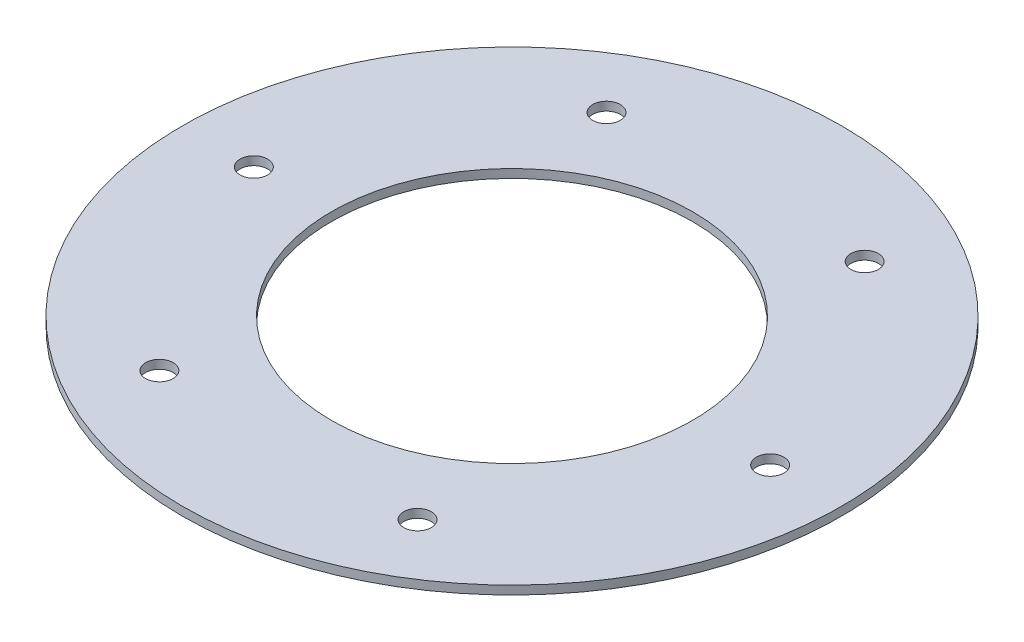
ISO-10303-21;
HEADER;
FILE_DESCRIPTION(('STEP AP214'),'2;1');
FILE_NAME('part.step','',(''),(''),'','','');
FILE_SCHEMA(('AUTOMOTIVE_DESIGN { 1 0 10303 214 1 1 1 1 }'));
ENDSEC;
DATA;
#1=APPLICATION_CONTEXT('core data for automotive mechanical design processes');
#2=APPLICATION_PROTOCOL_DEFINITION('international standard','automotive_design',2000,#1);
#3=PRODUCT_CONTEXT('',#1,'mechanical');
#4=PRODUCT('Part','Part','',(#3));
#5=PRODUCT_RELATED_PRODUCT_CATEGORY('part','',(#4));
#6=PRODUCT_DEFINITION_FORMATION('','',#4);
#7=PRODUCT_DEFINITION_CONTEXT('part definition',#1,'design');
#8=PRODUCT_DEFINITION('design','',#6,#7);
#9=PRODUCT_DEFINITION_SHAPE('','',#8);
#10=(LENGTH_UNIT() NAMED_UNIT(*) SI_UNIT(.MILLI.,.METRE.));
#11=(NAMED_UNIT(*) PLANE_ANGLE_UNIT() SI_UNIT($,.RADIAN.));
#12=(NAMED_UNIT(*) SI_UNIT($,.STERADIAN.) SOLID_ANGLE_UNIT());
#13=UNCERTAINTY_MEASURE_WITH_UNIT(LENGTH_MEASURE(1.E-05),#10,'distance_accuracy_value','');
#14=(GEOMETRIC_REPRESENTATION_CONTEXT(3) GLOBAL_UNCERTAINTY_ASSIGNED_CONTEXT((#13)) GLOBAL_UNIT_ASSIGNED_CONTEXT((#10,
#11,#12)) REPRESENTATION_CONTEXT('',''));
#15=CARTESIAN_POINT('',(0.,0.,0.));
#16=DIRECTION('',(0.,0.,1.));
#17=DIRECTION('',(1.,0.,0.));
#18=AXIS2_PLACEMENT_3D('',#15,#16,#17);
#19=CARTESIAN_POINT('',(0.,1.,0.));
#20=DIRECTION('',(0.,1.,0.));
#21=DIRECTION('',(0.,0.,1.));
#22=AXIS2_PLACEMENT_3D('',#19,#20,#21);
#23=PLANE('',#22);
#24=CARTESIAN_POINT('',(-14.9999999999998,1.,-25.9807621135333));
#25=DIRECTION('',(0.,1.,0.));
#26=DIRECTION('',(0.,0.,1.));
#27=AXIS2_PLACEMENT_3D('',#24,#25,#26);
#28=CIRCLE('',#27,1.6);
#29=CARTESIAN_POINT('',(-14.9999999999998,1.,-24.3807621135333));
#30=VERTEX_POINT('',#29);
#31=EDGE_CURVE('E71',#30,#30,#28,.T.);
#32=ORIENTED_EDGE('',*,*,#31,.F.);
#33=EDGE_LOOP('',(#32));
#34=FACE_BOUND('',#33,.T.);
#35=CARTESIAN_POINT('',(-15.0000000000001,1.,25.9807621135331));
#36=DIRECTION('',(0.,1.,0.));
#37=DIRECTION('',(0.,0.,1.));
#38=AXIS2_PLACEMENT_3D('',#35,#36,#37);
#39=CIRCLE('',#38,1.6);
#40=CARTESIAN_POINT('',(-15.0000000000001,1.,27.5807621135331));
#41=VERTEX_POINT('',#40);
#42=EDGE_CURVE('E59',#41,#41,#39,.T.);
#43=ORIENTED_EDGE('',*,*,#42,.F.);
#44=EDGE_LOOP('',(#43));
#45=FACE_BOUND('',#44,.T.);
#46=CARTESIAN_POINT('',(0.,1.,0.));
#47=DIRECTION('',(0.,1.,0.));
#48=DIRECTION('',(0.,0.,1.));
#49=AXIS2_PLACEMENT_3D('',#46,#47,#48);
#50=CIRCLE('',#49,21.);
#51=CARTESIAN_POINT('',(0.,1.,21.));
#52=VERTEX_POINT('',#51);
#53=EDGE_CURVE('E47',#52,#52,#50,.T.);
#54=ORIENTED_EDGE('',*,*,#53,.F.);
#55=EDGE_LOOP('',(#54));
#56=FACE_BOUND('',#55,.T.);
#57=CARTESIAN_POINT('',(0.,1.,0.));
#58=DIRECTION('',(0.,1.,0.));
#59=DIRECTION('',(0.,0.,1.));
#60=AXIS2_PLACEMENT_3D('',#57,#58,#59);
#61=CIRCLE('',#60,38.3);
#62=CARTESIAN_POINT('',(0.,1.,38.3));
#63=VERTEX_POINT('',#62);
#64=EDGE_CURVE('E10',#63,#63,#61,.T.);
#65=ORIENTED_EDGE('',*,*,#64,.T.);
#66=EDGE_LOOP('',(#65));
#67=FACE_BOUND('',#66,.T.);
#68=CARTESIAN_POINT('',(30.,1.,0.));
#69=DIRECTION('',(0.,1.,0.));
#70=DIRECTION('',(0.,0.,1.));
#71=AXIS2_PLACEMENT_3D('',#68,#69,#70);
#72=CIRCLE('',#71,1.6);
#73=CARTESIAN_POINT('',(30.,1.,1.6));
#74=VERTEX_POINT('',#73);
#75=EDGE_CURVE('E42',#74,#74,#72,.T.);
#76=ORIENTED_EDGE('',*,*,#75,.F.);
#77=EDGE_LOOP('',(#76));
#78=FACE_BOUND('',#77,.T.);
#79=CARTESIAN_POINT('',(14.9999999999999,1.,25.9807621135332));
#80=DIRECTION('',(0.,1.,0.));
#81=DIRECTION('',(0.,0.,1.));
#82=AXIS2_PLACEMENT_3D('',#79,#80,#81);
#83=CIRCLE('',#82,1.6);
#84=CARTESIAN_POINT('',(14.9999999999999,1.,27.5807621135332));
#85=VERTEX_POINT('',#84);
#86=EDGE_CURVE('E53',#85,#85,#83,.T.);
#87=ORIENTED_EDGE('',*,*,#86,.F.);
#88=EDGE_LOOP('',(#87));
#89=FACE_BOUND('',#88,.T.);
#90=CARTESIAN_POINT('',(-30.,1.,-2.09488880330588E-13));
#91=DIRECTION('',(0.,1.,0.));
#92=DIRECTION('',(0.,0.,1.));
#93=AXIS2_PLACEMENT_3D('',#90,#91,#92);
#94=CIRCLE('',#93,1.6);
#95=CARTESIAN_POINT('',(-30.,1.,1.59999999999979));
#96=VERTEX_POINT('',#95);
#97=EDGE_CURVE('E65',#96,#96,#94,.T.);
#98=ORIENTED_EDGE('',*,*,#97,.F.);
#99=EDGE_LOOP('',(#98));
#100=FACE_BOUND('',#99,.T.);
#101=CARTESIAN_POINT('',(15.0000000000003,1.,-25.980762113533));
#102=DIRECTION('',(0.,1.,0.));
#103=DIRECTION('',(0.,0.,1.));
#104=AXIS2_PLACEMENT_3D('',#101,#102,#103);
#105=CIRCLE('',#104,1.6);
#106=CARTESIAN_POINT('',(15.0000000000003,1.,-24.380762113533));
#107=VERTEX_POINT('',#106);
#108=EDGE_CURVE('E77',#107,#107,#105,.T.);
#109=ORIENTED_EDGE('',*,*,#108,.F.);
#110=EDGE_LOOP('',(#109));
#111=FACE_BOUND('',#110,.T.);
#112=ADVANCED_FACE('F31',(#34,#45,#56,#67,#78,#89,#100,#111),#23,.T.);
#113=CARTESIAN_POINT('',(0.,0.,0.));
#114=DIRECTION('',(0.,1.,0.));
#115=DIRECTION('',(0.,0.,1.));
#116=AXIS2_PLACEMENT_3D('',#113,#114,#115);
#117=PLANE('',#116);
#118=CARTESIAN_POINT('',(0.,0.,0.));
#119=DIRECTION('',(0.,1.,0.));
#120=DIRECTION('',(0.,0.,1.));
#121=AXIS2_PLACEMENT_3D('',#118,#119,#120);
#122=CIRCLE('',#121,38.3);
#123=CARTESIAN_POINT('',(0.,0.,38.3));
#124=VERTEX_POINT('',#123);
#125=EDGE_CURVE('E35',#124,#124,#122,.T.);
#126=ORIENTED_EDGE('',*,*,#125,.F.);
#127=EDGE_LOOP('',(#126));
#128=FACE_BOUND('',#127,.T.);
#129=CARTESIAN_POINT('',(30.,0.,0.));
#130=DIRECTION('',(0.,1.,0.));
#131=DIRECTION('',(0.,0.,1.));
#132=AXIS2_PLACEMENT_3D('',#129,#130,#131);
#133=CIRCLE('',#132,1.6);
#134=CARTESIAN_POINT('',(30.,0.,1.6));
#135=VERTEX_POINT('',#134);
#136=EDGE_CURVE('E44',#135,#135,#133,.T.);
#137=ORIENTED_EDGE('',*,*,#136,.T.);
#138=EDGE_LOOP('',(#137));
#139=FACE_BOUND('',#138,.T.);
#140=CARTESIAN_POINT('',(0.,0.,0.));
#141=DIRECTION('',(0.,1.,0.));
#142=DIRECTION('',(0.,0.,1.));
#143=AXIS2_PLACEMENT_3D('',#140,#141,#142);
#144=CIRCLE('',#143,21.);
#145=CARTESIAN_POINT('',(0.,0.,21.));
#146=VERTEX_POINT('',#145);
#147=EDGE_CURVE('E50',#146,#146,#144,.T.);
#148=ORIENTED_EDGE('',*,*,#147,.T.);
#149=EDGE_LOOP('',(#148));
#150=FACE_BOUND('',#149,.T.);
#151=CARTESIAN_POINT('',(14.9999999999999,0.,25.9807621135332));
#152=DIRECTION('',(0.,1.,0.));
#153=DIRECTION('',(0.,0.,1.));
#154=AXIS2_PLACEMENT_3D('',#151,#152,#153);
#155=CIRCLE('',#154,1.6);
#156=CARTESIAN_POINT('',(14.9999999999999,0.,27.5807621135332));
#157=VERTEX_POINT('',#156);
#158=EDGE_CURVE('E56',#157,#157,#155,.T.);
#159=ORIENTED_EDGE('',*,*,#158,.T.);
#160=EDGE_LOOP('',(#159));
#161=FACE_BOUND('',#160,.T.);
#162=CARTESIAN_POINT('',(-15.0000000000001,0.,25.9807621135331));
#163=DIRECTION('',(0.,1.,0.));
#164=DIRECTION('',(0.,0.,1.));
#165=AXIS2_PLACEMENT_3D('',#162,#163,#164);
#166=CIRCLE('',#165,1.6);
#167=CARTESIAN_POINT('',(-15.0000000000001,0.,27.5807621135331));
#168=VERTEX_POINT('',#167);
#169=EDGE_CURVE('E62',#168,#168,#166,.T.);
#170=ORIENTED_EDGE('',*,*,#169,.T.);
#171=EDGE_LOOP('',(#170));
#172=FACE_BOUND('',#171,.T.);
#173=CARTESIAN_POINT('',(-30.,0.,-2.09488880330588E-13));
#174=DIRECTION('',(0.,1.,0.));
#175=DIRECTION('',(0.,0.,1.));
#176=AXIS2_PLACEMENT_3D('',#173,#174,#175);
#177=CIRCLE('',#176,1.6);
#178=CARTESIAN_POINT('',(-30.,0.,1.59999999999979));
#179=VERTEX_POINT('',#178);
#180=EDGE_CURVE('E68',#179,#179,#177,.T.);
#181=ORIENTED_EDGE('',*,*,#180,.T.);
#182=EDGE_LOOP('',(#181));
#183=FACE_BOUND('',#182,.T.);
#184=CARTESIAN_POINT('',(-14.9999999999998,0.,-25.9807621135333));
#185=DIRECTION('',(0.,1.,0.));
#186=DIRECTION('',(0.,0.,1.));
#187=AXIS2_PLACEMENT_3D('',#184,#185,#186);
#188=CIRCLE('',#187,1.6);
#189=CARTESIAN_POINT('',(-14.9999999999998,0.,-24.3807621135333));
#190=VERTEX_POINT('',#189);
#191=EDGE_CURVE('E74',#190,#190,#188,.T.);
#192=ORIENTED_EDGE('',*,*,#191,.T.);
#193=EDGE_LOOP('',(#192));
#194=FACE_BOUND('',#193,.T.);
#195=CARTESIAN_POINT('',(15.0000000000003,0.,-25.980762113533));
#196=DIRECTION('',(0.,1.,0.));
#197=DIRECTION('',(0.,0.,1.));
#198=AXIS2_PLACEMENT_3D('',#195,#196,#197);
#199=CIRCLE('',#198,1.6);
#200=CARTESIAN_POINT('',(15.0000000000003,0.,-24.380762113533));
#201=VERTEX_POINT('',#200);
#202=EDGE_CURVE('E80',#201,#201,#199,.T.);
#203=ORIENTED_EDGE('',*,*,#202,.T.);
#204=EDGE_LOOP('',(#203));
#205=FACE_BOUND('',#204,.T.);
#206=ADVANCED_FACE('F90',(#128,#139,#150,#161,#172,#183,#194,#205),#117,.F.);
#207=CARTESIAN_POINT('',(0.,1.,0.));
#208=DIRECTION('',(0.,-1.,0.));
#209=DIRECTION('',(0.,0.,-1.));
#210=AXIS2_PLACEMENT_3D('',#207,#208,#209);
#211=CYLINDRICAL_SURFACE('',#210,38.3);
#212=ORIENTED_EDGE('',*,*,#64,.F.);
#213=EDGE_LOOP('',(#212));
#214=FACE_BOUND('',#213,.T.);
#215=ORIENTED_EDGE('',*,*,#125,.T.);
#216=EDGE_LOOP('',(#215));
#217=FACE_BOUND('',#216,.T.);
#218=ADVANCED_FACE('F33',(#214,#217),#211,.T.);
#219=CARTESIAN_POINT('',(30.,1.,0.));
#220=DIRECTION('',(0.,-1.,0.));
#221=DIRECTION('',(0.,0.,-1.));
#222=AXIS2_PLACEMENT_3D('',#219,#220,#221);
#223=CYLINDRICAL_SURFACE('',#222,1.6);
#224=ORIENTED_EDGE('',*,*,#75,.T.);
#225=EDGE_LOOP('',(#224));
#226=FACE_BOUND('',#225,.T.);
#227=ORIENTED_EDGE('',*,*,#136,.F.);
#228=EDGE_LOOP('',(#227));
#229=FACE_BOUND('',#228,.T.);
#230=ADVANCED_FACE('F100',(#226,#229),#223,.F.);
#231=CARTESIAN_POINT('',(0.,1.,0.));
#232=DIRECTION('',(0.,-1.,0.));
#233=DIRECTION('',(0.,0.,-1.));
#234=AXIS2_PLACEMENT_3D('',#231,#232,#233);
#235=CYLINDRICAL_SURFACE('',#234,21.);
#236=ORIENTED_EDGE('',*,*,#53,.T.);
#237=EDGE_LOOP('',(#236));
#238=FACE_BOUND('',#237,.T.);
#239=ORIENTED_EDGE('',*,*,#147,.F.);
#240=EDGE_LOOP('',(#239));
#241=FACE_BOUND('',#240,.T.);
#242=ADVANCED_FACE('F103',(#238,#241),#235,.F.);
#243=CARTESIAN_POINT('',(14.9999999999999,1.,25.9807621135332));
#244=DIRECTION('',(0.,-1.,0.));
#245=DIRECTION('',(0.,0.,-1.));
#246=AXIS2_PLACEMENT_3D('',#243,#244,#245);
#247=CYLINDRICAL_SURFACE('',#246,1.6);
#248=ORIENTED_EDGE('',*,*,#86,.T.);
#249=EDGE_LOOP('',(#248));
#250=FACE_BOUND('',#249,.T.);
#251=ORIENTED_EDGE('',*,*,#158,.F.);
#252=EDGE_LOOP('',(#251));
#253=FACE_BOUND('',#252,.T.);
#254=ADVANCED_FACE('F107',(#250,#253),#247,.F.);
#255=CARTESIAN_POINT('',(-15.0000000000001,1.,25.9807621135331));
#256=DIRECTION('',(0.,-1.,0.));
#257=DIRECTION('',(0.,0.,-1.));
#258=AXIS2_PLACEMENT_3D('',#255,#256,#257);
#259=CYLINDRICAL_SURFACE('',#258,1.6);
#260=ORIENTED_EDGE('',*,*,#42,.T.);
#261=EDGE_LOOP('',(#260));
#262=FACE_BOUND('',#261,.T.);
#263=ORIENTED_EDGE('',*,*,#169,.F.);
#264=EDGE_LOOP('',(#263));
#265=FACE_BOUND('',#264,.T.);
#266=ADVANCED_FACE('F111',(#262,#265),#259,.F.);
#267=CARTESIAN_POINT('',(-30.,1.,-2.09488880330588E-13));
#268=DIRECTION('',(0.,-1.,0.));
#269=DIRECTION('',(0.,0.,-1.));
#270=AXIS2_PLACEMENT_3D('',#267,#268,#269);
#271=CYLINDRICAL_SURFACE('',#270,1.6);
#272=ORIENTED_EDGE('',*,*,#97,.T.);
#273=EDGE_LOOP('',(#272));
#274=FACE_BOUND('',#273,.T.);
#275=ORIENTED_EDGE('',*,*,#180,.F.);
#276=EDGE_LOOP('',(#275));
#277=FACE_BOUND('',#276,.T.);
#278=ADVANCED_FACE('F115',(#274,#277),#271,.F.);
#279=CARTESIAN_POINT('',(-14.9999999999998,1.,-25.9807621135333));
#280=DIRECTION('',(0.,-1.,0.));
#281=DIRECTION('',(0.,0.,-1.));
#282=AXIS2_PLACEMENT_3D('',#279,#280,#281);
#283=CYLINDRICAL_SURFACE('',#282,1.6);
#284=ORIENTED_EDGE('',*,*,#31,.T.);
#285=EDGE_LOOP('',(#284));
#286=FACE_BOUND('',#285,.T.);
#287=ORIENTED_EDGE('',*,*,#191,.F.);
#288=EDGE_LOOP('',(#287));
#289=FACE_BOUND('',#288,.T.);
#290=ADVANCED_FACE('F119',(#286,#289),#283,.F.);
#291=CARTESIAN_POINT('',(15.0000000000003,1.,-25.980762113533));
#292=DIRECTION('',(0.,-1.,0.));
#293=DIRECTION('',(0.,0.,-1.));
#294=AXIS2_PLACEMENT_3D('',#291,#292,#293);
#295=CYLINDRICAL_SURFACE('',#294,1.6);
#296=ORIENTED_EDGE('',*,*,#108,.T.);
#297=EDGE_LOOP('',(#296));
#298=FACE_BOUND('',#297,.T.);
#299=ORIENTED_EDGE('',*,*,#202,.F.);
#300=EDGE_LOOP('',(#299));
#301=FACE_BOUND('',#300,.T.);
#302=ADVANCED_FACE('F86',(#298,#301),#295,.F.);
#303=CLOSED_SHELL('',(#112,#206,#218,#230,#242,#254,#266,#278,#290,#302));
#304=MANIFOLD_SOLID_BREP('B2',#303);
#305=ADVANCED_BREP_SHAPE_REPRESENTATION('',(#18,#304),#14);
#306=SHAPE_DEFINITION_REPRESENTATION(#9,#305);
ENDSEC;
END-ISO-10303-21;
